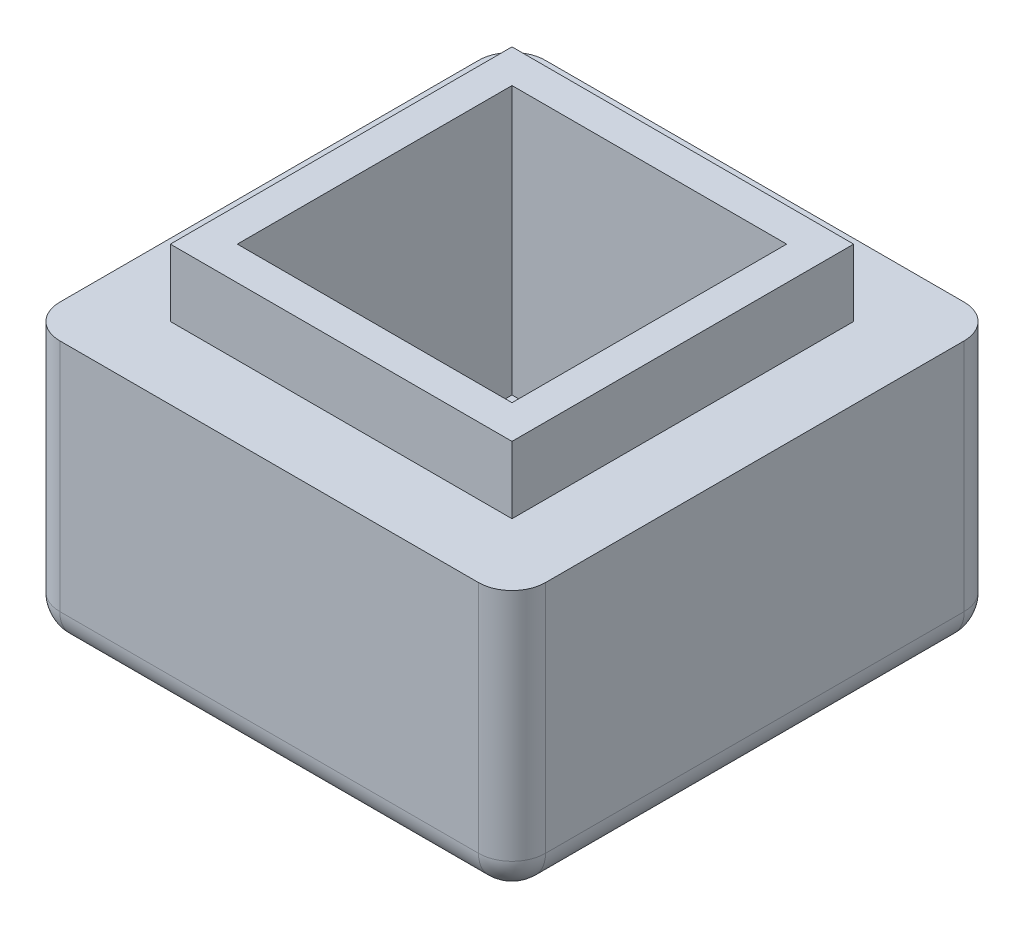
ISO-10303-21;
HEADER;
FILE_DESCRIPTION(('STEP AP214'),'2;1');
FILE_NAME('part.step','',(''),(''),'','','');
FILE_SCHEMA(('AUTOMOTIVE_DESIGN { 1 0 10303 214 1 1 1 1 }'));
ENDSEC;
DATA;
#1=APPLICATION_CONTEXT('core data for automotive mechanical design processes');
#2=APPLICATION_PROTOCOL_DEFINITION('international standard','automotive_design',2000,#1);
#3=PRODUCT_CONTEXT('',#1,'mechanical');
#4=PRODUCT('Part','Part','',(#3));
#5=PRODUCT_RELATED_PRODUCT_CATEGORY('part','',(#4));
#6=PRODUCT_DEFINITION_FORMATION('','',#4);
#7=PRODUCT_DEFINITION_CONTEXT('part definition',#1,'design');
#8=PRODUCT_DEFINITION('design','',#6,#7);
#9=PRODUCT_DEFINITION_SHAPE('','',#8);
#10=(LENGTH_UNIT() NAMED_UNIT(*) SI_UNIT(.MILLI.,.METRE.));
#11=(NAMED_UNIT(*) PLANE_ANGLE_UNIT() SI_UNIT($,.RADIAN.));
#12=(NAMED_UNIT(*) SI_UNIT($,.STERADIAN.) SOLID_ANGLE_UNIT());
#13=UNCERTAINTY_MEASURE_WITH_UNIT(LENGTH_MEASURE(1.E-05),#10,'distance_accuracy_value','');
#14=(GEOMETRIC_REPRESENTATION_CONTEXT(3) GLOBAL_UNCERTAINTY_ASSIGNED_CONTEXT((#13)) GLOBAL_UNIT_ASSIGNED_CONTEXT((#10,
#11,#12)) REPRESENTATION_CONTEXT('',''));
#15=CARTESIAN_POINT('',(0.,0.,0.));
#16=DIRECTION('',(0.,0.,1.));
#17=DIRECTION('',(1.,0.,0.));
#18=AXIS2_PLACEMENT_3D('',#15,#16,#17);
#19=CARTESIAN_POINT('',(0.,4.,0.));
#20=DIRECTION('',(0.,-1.,0.));
#21=DIRECTION('',(0.,0.,-1.));
#22=AXIS2_PLACEMENT_3D('',#19,#20,#21);
#23=PLANE('',#22);
#24=DIRECTION('',(0.,0.,1.));
#25=VECTOR('',#24,1.);
#26=CARTESIAN_POINT('',(-3.625,4.,3.625));
#27=LINE('',#26,#25);
#28=CARTESIAN_POINT('',(-3.625,4.,-3.125));
#29=VERTEX_POINT('',#28);
#30=CARTESIAN_POINT('',(-3.625,4.,3.125));
#31=VERTEX_POINT('',#30);
#32=EDGE_CURVE('E273',#29,#31,#27,.T.);
#33=ORIENTED_EDGE('',*,*,#32,.T.);
#34=CARTESIAN_POINT('',(-3.125,4.,3.125));
#35=DIRECTION('',(0.,-1.,0.));
#36=DIRECTION('',(0.,0.,-1.));
#37=AXIS2_PLACEMENT_3D('',#34,#35,#36);
#38=CIRCLE('',#37,0.5);
#39=CARTESIAN_POINT('',(-3.125,4.,3.625));
#40=VERTEX_POINT('',#39);
#41=EDGE_CURVE('E11',#31,#40,#38,.F.);
#42=ORIENTED_EDGE('',*,*,#41,.T.);
#43=DIRECTION('',(1.,0.,0.));
#44=VECTOR('',#43,1.);
#45=CARTESIAN_POINT('',(-3.625,4.,3.625));
#46=LINE('',#45,#44);
#47=CARTESIAN_POINT('',(3.125,4.,3.625));
#48=VERTEX_POINT('',#47);
#49=EDGE_CURVE('E277',#40,#48,#46,.T.);
#50=ORIENTED_EDGE('',*,*,#49,.T.);
#51=CARTESIAN_POINT('',(3.125,4.,3.125));
#52=DIRECTION('',(0.,-1.,0.));
#53=DIRECTION('',(0.,0.,-1.));
#54=AXIS2_PLACEMENT_3D('',#51,#52,#53);
#55=CIRCLE('',#54,0.5);
#56=CARTESIAN_POINT('',(3.625,4.,3.125));
#57=VERTEX_POINT('',#56);
#58=EDGE_CURVE('E332',#48,#57,#55,.F.);
#59=ORIENTED_EDGE('',*,*,#58,.T.);
#60=DIRECTION('',(0.,0.,-1.));
#61=VECTOR('',#60,1.);
#62=CARTESIAN_POINT('',(3.625,4.,3.625));
#63=LINE('',#62,#61);
#64=CARTESIAN_POINT('',(3.625,4.,-3.125));
#65=VERTEX_POINT('',#64);
#66=EDGE_CURVE('E265',#57,#65,#63,.T.);
#67=ORIENTED_EDGE('',*,*,#66,.T.);
#68=CARTESIAN_POINT('',(3.125,4.,-3.125));
#69=DIRECTION('',(0.,-1.,0.));
#70=DIRECTION('',(0.,0.,-1.));
#71=AXIS2_PLACEMENT_3D('',#68,#69,#70);
#72=CIRCLE('',#71,0.5);
#73=CARTESIAN_POINT('',(3.125,4.,-3.625));
#74=VERTEX_POINT('',#73);
#75=EDGE_CURVE('E49',#65,#74,#72,.F.);
#76=ORIENTED_EDGE('',*,*,#75,.T.);
#77=DIRECTION('',(-1.,0.,0.));
#78=VECTOR('',#77,1.);
#79=CARTESIAN_POINT('',(-3.625,4.,-3.625));
#80=LINE('',#79,#78);
#81=CARTESIAN_POINT('',(-3.125,4.,-3.625));
#82=VERTEX_POINT('',#81);
#83=EDGE_CURVE('E269',#74,#82,#80,.T.);
#84=ORIENTED_EDGE('',*,*,#83,.T.);
#85=CARTESIAN_POINT('',(-3.125,4.,-3.125));
#86=DIRECTION('',(0.,-1.,0.));
#87=DIRECTION('',(0.,0.,-1.));
#88=AXIS2_PLACEMENT_3D('',#85,#86,#87);
#89=CIRCLE('',#88,0.5);
#90=EDGE_CURVE('E329',#82,#29,#89,.F.);
#91=ORIENTED_EDGE('',*,*,#90,.T.);
#92=EDGE_LOOP('',(#33,#42,#50,#59,#67,#76,#84,#91));
#93=FACE_BOUND('',#92,.T.);
#94=DIRECTION('',(0.,0.,-1.));
#95=VECTOR('',#94,1.);
#96=CARTESIAN_POINT('',(2.55,4.,2.55));
#97=LINE('',#96,#95);
#98=CARTESIAN_POINT('',(2.55,4.,2.55));
#99=VERTEX_POINT('',#98);
#100=CARTESIAN_POINT('',(2.55,4.,-2.55));
#101=VERTEX_POINT('',#100);
#102=EDGE_CURVE('E215',#99,#101,#97,.T.);
#103=ORIENTED_EDGE('',*,*,#102,.F.);
#104=DIRECTION('',(1.,0.,0.));
#105=VECTOR('',#104,1.);
#106=CARTESIAN_POINT('',(-2.55,4.,2.55));
#107=LINE('',#106,#105);
#108=CARTESIAN_POINT('',(-2.55,4.,2.55));
#109=VERTEX_POINT('',#108);
#110=EDGE_CURVE('E226',#109,#99,#107,.T.);
#111=ORIENTED_EDGE('',*,*,#110,.F.);
#112=DIRECTION('',(0.,0.,1.));
#113=VECTOR('',#112,1.);
#114=CARTESIAN_POINT('',(-2.55,4.,2.55));
#115=LINE('',#114,#113);
#116=CARTESIAN_POINT('',(-2.55,4.,-2.55));
#117=VERTEX_POINT('',#116);
#118=EDGE_CURVE('E243',#117,#109,#115,.T.);
#119=ORIENTED_EDGE('',*,*,#118,.F.);
#120=DIRECTION('',(-1.,0.,0.));
#121=VECTOR('',#120,1.);
#122=CARTESIAN_POINT('',(-2.55,4.,-2.55));
#123=LINE('',#122,#121);
#124=EDGE_CURVE('E239',#101,#117,#123,.T.);
#125=ORIENTED_EDGE('',*,*,#124,.F.);
#126=EDGE_LOOP('',(#103,#111,#119,#125));
#127=FACE_BOUND('',#126,.T.);
#128=ADVANCED_FACE('F39',(#93,#127),#23,.F.);
#129=CARTESIAN_POINT('',(3.625,4.,3.625));
#130=DIRECTION('',(-1.,0.,0.));
#131=DIRECTION('',(0.,0.,1.));
#132=AXIS2_PLACEMENT_3D('',#129,#130,#131);
#133=PLANE('',#132);
#134=DIRECTION('',(0.,0.,-1.));
#135=VECTOR('',#134,1.);
#136=CARTESIAN_POINT('',(3.625,0.5,-3.625));
#137=LINE('',#136,#135);
#138=CARTESIAN_POINT('',(3.625,0.5,3.125));
#139=VERTEX_POINT('',#138);
#140=CARTESIAN_POINT('',(3.625,0.5,-3.125));
#141=VERTEX_POINT('',#140);
#142=EDGE_CURVE('E57',#139,#141,#137,.T.);
#143=ORIENTED_EDGE('',*,*,#142,.T.);
#144=DIRECTION('',(0.,-1.,0.));
#145=VECTOR('',#144,1.);
#146=CARTESIAN_POINT('',(3.625,4.,-3.125));
#147=LINE('',#146,#145);
#148=EDGE_CURVE('E326',#141,#65,#147,.F.);
#149=ORIENTED_EDGE('',*,*,#148,.T.);
#150=ORIENTED_EDGE('',*,*,#66,.F.);
#151=DIRECTION('',(0.,-1.,0.));
#152=VECTOR('',#151,1.);
#153=CARTESIAN_POINT('',(3.625,4.,3.125));
#154=LINE('',#153,#152);
#155=EDGE_CURVE('E62',#57,#139,#154,.T.);
#156=ORIENTED_EDGE('',*,*,#155,.T.);
#157=EDGE_LOOP('',(#143,#149,#150,#156));
#158=FACE_BOUND('',#157,.T.);
#159=ADVANCED_FACE('F399',(#158),#133,.F.);
#160=CARTESIAN_POINT('',(-3.625,4.,-3.625));
#161=DIRECTION('',(0.,0.,1.));
#162=DIRECTION('',(1.,0.,0.));
#163=AXIS2_PLACEMENT_3D('',#160,#161,#162);
#164=PLANE('',#163);
#165=ORIENTED_EDGE('',*,*,#83,.F.);
#166=DIRECTION('',(0.,-1.,0.));
#167=VECTOR('',#166,1.);
#168=CARTESIAN_POINT('',(3.125,4.,-3.625));
#169=LINE('',#168,#167);
#170=CARTESIAN_POINT('',(3.125,0.5,-3.625));
#171=VERTEX_POINT('',#170);
#172=EDGE_CURVE('E288',#74,#171,#169,.T.);
#173=ORIENTED_EDGE('',*,*,#172,.T.);
#174=DIRECTION('',(-1.,0.,0.));
#175=VECTOR('',#174,1.);
#176=CARTESIAN_POINT('',(-3.625,0.5,-3.625));
#177=LINE('',#176,#175);
#178=CARTESIAN_POINT('',(-3.125,0.5,-3.625));
#179=VERTEX_POINT('',#178);
#180=EDGE_CURVE('E284',#171,#179,#177,.T.);
#181=ORIENTED_EDGE('',*,*,#180,.T.);
#182=DIRECTION('',(0.,-1.,0.));
#183=VECTOR('',#182,1.);
#184=CARTESIAN_POINT('',(-3.125,4.,-3.625));
#185=LINE('',#184,#183);
#186=EDGE_CURVE('E281',#179,#82,#185,.F.);
#187=ORIENTED_EDGE('',*,*,#186,.T.);
#188=EDGE_LOOP('',(#165,#173,#181,#187));
#189=FACE_BOUND('',#188,.T.);
#190=ADVANCED_FACE('F440',(#189),#164,.F.);
#191=CARTESIAN_POINT('',(-3.625,4.,3.625));
#192=DIRECTION('',(1.,0.,0.));
#193=DIRECTION('',(0.,0.,-1.));
#194=AXIS2_PLACEMENT_3D('',#191,#192,#193);
#195=PLANE('',#194);
#196=DIRECTION('',(0.,0.,1.));
#197=VECTOR('',#196,1.);
#198=CARTESIAN_POINT('',(-3.625,0.5,3.625));
#199=LINE('',#198,#197);
#200=CARTESIAN_POINT('',(-3.625,0.5,-3.125));
#201=VERTEX_POINT('',#200);
#202=CARTESIAN_POINT('',(-3.625,0.5,3.125));
#203=VERTEX_POINT('',#202);
#204=EDGE_CURVE('E307',#201,#203,#199,.T.);
#205=ORIENTED_EDGE('',*,*,#204,.T.);
#206=DIRECTION('',(0.,-1.,0.));
#207=VECTOR('',#206,1.);
#208=CARTESIAN_POINT('',(-3.625,4.,3.125));
#209=LINE('',#208,#207);
#210=EDGE_CURVE('E310',#203,#31,#209,.F.);
#211=ORIENTED_EDGE('',*,*,#210,.T.);
#212=ORIENTED_EDGE('',*,*,#32,.F.);
#213=DIRECTION('',(0.,-1.,0.));
#214=VECTOR('',#213,1.);
#215=CARTESIAN_POINT('',(-3.625,4.,-3.125));
#216=LINE('',#215,#214);
#217=EDGE_CURVE('E304',#29,#201,#216,.T.);
#218=ORIENTED_EDGE('',*,*,#217,.T.);
#219=EDGE_LOOP('',(#205,#211,#212,#218));
#220=FACE_BOUND('',#219,.T.);
#221=ADVANCED_FACE('F443',(#220),#195,.F.);
#222=CARTESIAN_POINT('',(-3.625,4.,3.625));
#223=DIRECTION('',(0.,0.,-1.));
#224=DIRECTION('',(-1.,0.,0.));
#225=AXIS2_PLACEMENT_3D('',#222,#223,#224);
#226=PLANE('',#225);
#227=ORIENTED_EDGE('',*,*,#49,.F.);
#228=DIRECTION('',(0.,-1.,0.));
#229=VECTOR('',#228,1.);
#230=CARTESIAN_POINT('',(-3.125,4.,3.625));
#231=LINE('',#230,#229);
#232=CARTESIAN_POINT('',(-3.125,0.5,3.625));
#233=VERTEX_POINT('',#232);
#234=EDGE_CURVE('E319',#40,#233,#231,.T.);
#235=ORIENTED_EDGE('',*,*,#234,.T.);
#236=DIRECTION('',(1.,0.,0.));
#237=VECTOR('',#236,1.);
#238=CARTESIAN_POINT('',(3.625,0.5,3.625));
#239=LINE('',#238,#237);
#240=CARTESIAN_POINT('',(3.125,0.5,3.625));
#241=VERTEX_POINT('',#240);
#242=EDGE_CURVE('E316',#233,#241,#239,.T.);
#243=ORIENTED_EDGE('',*,*,#242,.T.);
#244=DIRECTION('',(0.,-1.,0.));
#245=VECTOR('',#244,1.);
#246=CARTESIAN_POINT('',(3.125,4.,3.625));
#247=LINE('',#246,#245);
#248=EDGE_CURVE('E313',#241,#48,#247,.F.);
#249=ORIENTED_EDGE('',*,*,#248,.T.);
#250=EDGE_LOOP('',(#227,#235,#243,#249));
#251=FACE_BOUND('',#250,.T.);
#252=ADVANCED_FACE('F408',(#251),#226,.F.);
#253=CARTESIAN_POINT('',(0.,0.,0.));
#254=DIRECTION('',(0.,-1.,0.));
#255=DIRECTION('',(0.,0.,-1.));
#256=AXIS2_PLACEMENT_3D('',#253,#254,#255);
#257=PLANE('',#256);
#258=DIRECTION('',(0.,0.,1.));
#259=VECTOR('',#258,1.);
#260=CARTESIAN_POINT('',(-3.125,0.,-3.625));
#261=LINE('',#260,#259);
#262=CARTESIAN_POINT('',(-3.125,0.,3.125));
#263=VERTEX_POINT('',#262);
#264=CARTESIAN_POINT('',(-3.125,0.,-3.125));
#265=VERTEX_POINT('',#264);
#266=EDGE_CURVE('E297',#263,#265,#261,.F.);
#267=ORIENTED_EDGE('',*,*,#266,.T.);
#268=DIRECTION('',(-1.,0.,0.));
#269=VECTOR('',#268,1.);
#270=CARTESIAN_POINT('',(3.625,0.,-3.125));
#271=LINE('',#270,#269);
#272=CARTESIAN_POINT('',(3.125,0.,-3.125));
#273=VERTEX_POINT('',#272);
#274=EDGE_CURVE('E300',#265,#273,#271,.F.);
#275=ORIENTED_EDGE('',*,*,#274,.T.);
#276=DIRECTION('',(0.,0.,-1.));
#277=VECTOR('',#276,1.);
#278=CARTESIAN_POINT('',(3.125,0.,3.625));
#279=LINE('',#278,#277);
#280=CARTESIAN_POINT('',(3.125,0.,3.125));
#281=VERTEX_POINT('',#280);
#282=EDGE_CURVE('E291',#273,#281,#279,.F.);
#283=ORIENTED_EDGE('',*,*,#282,.T.);
#284=DIRECTION('',(1.,0.,0.));
#285=VECTOR('',#284,1.);
#286=CARTESIAN_POINT('',(-3.625,0.,3.125));
#287=LINE('',#286,#285);
#288=EDGE_CURVE('E294',#281,#263,#287,.F.);
#289=ORIENTED_EDGE('',*,*,#288,.T.);
#290=EDGE_LOOP('',(#267,#275,#283,#289));
#291=FACE_BOUND('',#290,.T.);
#292=ADVANCED_FACE('F427',(#291),#257,.T.);
#293=CARTESIAN_POINT('',(2.55,5.,2.55));
#294=DIRECTION('',(-1.,0.,0.));
#295=DIRECTION('',(0.,0.,1.));
#296=AXIS2_PLACEMENT_3D('',#293,#294,#295);
#297=PLANE('',#296);
#298=ORIENTED_EDGE('',*,*,#102,.T.);
#299=DIRECTION('',(0.,-1.,0.));
#300=VECTOR('',#299,1.);
#301=CARTESIAN_POINT('',(2.55,5.,-2.55));
#302=LINE('',#301,#300);
#303=CARTESIAN_POINT('',(2.55,5.,-2.55));
#304=VERTEX_POINT('',#303);
#305=EDGE_CURVE('E261',#304,#101,#302,.T.);
#306=ORIENTED_EDGE('',*,*,#305,.F.);
#307=DIRECTION('',(0.,0.,-1.));
#308=VECTOR('',#307,1.);
#309=CARTESIAN_POINT('',(2.55,5.,2.55));
#310=LINE('',#309,#308);
#311=CARTESIAN_POINT('',(2.55,5.,2.55));
#312=VERTEX_POINT('',#311);
#313=EDGE_CURVE('E221',#312,#304,#310,.T.);
#314=ORIENTED_EDGE('',*,*,#313,.F.);
#315=DIRECTION('',(0.,-1.,0.));
#316=VECTOR('',#315,1.);
#317=CARTESIAN_POINT('',(2.55,5.,2.55));
#318=LINE('',#317,#316);
#319=EDGE_CURVE('E235',#312,#99,#318,.T.);
#320=ORIENTED_EDGE('',*,*,#319,.T.);
#321=EDGE_LOOP('',(#298,#306,#314,#320));
#322=FACE_BOUND('',#321,.T.);
#323=ADVANCED_FACE('F460',(#322),#297,.F.);
#324=CARTESIAN_POINT('',(-2.55,5.,-2.55));
#325=DIRECTION('',(0.,0.,1.));
#326=DIRECTION('',(1.,0.,0.));
#327=AXIS2_PLACEMENT_3D('',#324,#325,#326);
#328=PLANE('',#327);
#329=ORIENTED_EDGE('',*,*,#124,.T.);
#330=DIRECTION('',(0.,-1.,0.));
#331=VECTOR('',#330,1.);
#332=CARTESIAN_POINT('',(-2.55,5.,-2.55));
#333=LINE('',#332,#331);
#334=CARTESIAN_POINT('',(-2.55,5.,-2.55));
#335=VERTEX_POINT('',#334);
#336=EDGE_CURVE('E257',#335,#117,#333,.T.);
#337=ORIENTED_EDGE('',*,*,#336,.F.);
#338=DIRECTION('',(-1.,0.,0.));
#339=VECTOR('',#338,1.);
#340=CARTESIAN_POINT('',(-2.55,5.,-2.55));
#341=LINE('',#340,#339);
#342=EDGE_CURVE('E225',#304,#335,#341,.T.);
#343=ORIENTED_EDGE('',*,*,#342,.F.);
#344=ORIENTED_EDGE('',*,*,#305,.T.);
#345=EDGE_LOOP('',(#329,#337,#343,#344));
#346=FACE_BOUND('',#345,.T.);
#347=ADVANCED_FACE('F466',(#346),#328,.F.);
#348=CARTESIAN_POINT('',(-2.55,5.,2.55));
#349=DIRECTION('',(1.,0.,0.));
#350=DIRECTION('',(0.,0.,-1.));
#351=AXIS2_PLACEMENT_3D('',#348,#349,#350);
#352=PLANE('',#351);
#353=ORIENTED_EDGE('',*,*,#118,.T.);
#354=DIRECTION('',(0.,-1.,0.));
#355=VECTOR('',#354,1.);
#356=CARTESIAN_POINT('',(-2.55,5.,2.55));
#357=LINE('',#356,#355);
#358=CARTESIAN_POINT('',(-2.55,5.,2.55));
#359=VERTEX_POINT('',#358);
#360=EDGE_CURVE('E253',#359,#109,#357,.T.);
#361=ORIENTED_EDGE('',*,*,#360,.F.);
#362=DIRECTION('',(0.,0.,1.));
#363=VECTOR('',#362,1.);
#364=CARTESIAN_POINT('',(-2.55,5.,2.55));
#365=LINE('',#364,#363);
#366=EDGE_CURVE('E229',#335,#359,#365,.T.);
#367=ORIENTED_EDGE('',*,*,#366,.F.);
#368=ORIENTED_EDGE('',*,*,#336,.T.);
#369=EDGE_LOOP('',(#353,#361,#367,#368));
#370=FACE_BOUND('',#369,.T.);
#371=ADVANCED_FACE('F471',(#370),#352,.F.);
#372=CARTESIAN_POINT('',(-2.55,5.,2.55));
#373=DIRECTION('',(0.,0.,-1.));
#374=DIRECTION('',(-1.,0.,0.));
#375=AXIS2_PLACEMENT_3D('',#372,#373,#374);
#376=PLANE('',#375);
#377=ORIENTED_EDGE('',*,*,#110,.T.);
#378=ORIENTED_EDGE('',*,*,#319,.F.);
#379=DIRECTION('',(1.,0.,0.));
#380=VECTOR('',#379,1.);
#381=CARTESIAN_POINT('',(-2.55,5.,2.55));
#382=LINE('',#381,#380);
#383=EDGE_CURVE('E232',#359,#312,#382,.T.);
#384=ORIENTED_EDGE('',*,*,#383,.F.);
#385=ORIENTED_EDGE('',*,*,#360,.T.);
#386=EDGE_LOOP('',(#377,#378,#384,#385));
#387=FACE_BOUND('',#386,.T.);
#388=ADVANCED_FACE('F477',(#387),#376,.F.);
#389=CARTESIAN_POINT('',(0.,5.,0.));
#390=DIRECTION('',(0.,-1.,0.));
#391=DIRECTION('',(0.,0.,-1.));
#392=AXIS2_PLACEMENT_3D('',#389,#390,#391);
#393=PLANE('',#392);
#394=DIRECTION('',(-1.,0.,0.));
#395=VECTOR('',#394,1.);
#396=CARTESIAN_POINT('',(-2.05,5.,-2.05));
#397=LINE('',#396,#395);
#398=CARTESIAN_POINT('',(2.05,5.,-2.05));
#399=VERTEX_POINT('',#398);
#400=CARTESIAN_POINT('',(-2.05,5.,-2.05));
#401=VERTEX_POINT('',#400);
#402=EDGE_CURVE('E206',#399,#401,#397,.T.);
#403=ORIENTED_EDGE('',*,*,#402,.F.);
#404=DIRECTION('',(0.,0.,-1.));
#405=VECTOR('',#404,1.);
#406=CARTESIAN_POINT('',(2.05,5.,2.05));
#407=LINE('',#406,#405);
#408=CARTESIAN_POINT('',(2.05,5.,2.05));
#409=VERTEX_POINT('',#408);
#410=EDGE_CURVE('E173',#409,#399,#407,.T.);
#411=ORIENTED_EDGE('',*,*,#410,.F.);
#412=DIRECTION('',(1.,0.,0.));
#413=VECTOR('',#412,1.);
#414=CARTESIAN_POINT('',(-2.05,5.,2.05));
#415=LINE('',#414,#413);
#416=CARTESIAN_POINT('',(-2.05,5.,2.05));
#417=VERTEX_POINT('',#416);
#418=EDGE_CURVE('E193',#417,#409,#415,.T.);
#419=ORIENTED_EDGE('',*,*,#418,.F.);
#420=DIRECTION('',(0.,0.,1.));
#421=VECTOR('',#420,1.);
#422=CARTESIAN_POINT('',(-2.05,5.,2.05));
#423=LINE('',#422,#421);
#424=EDGE_CURVE('E197',#401,#417,#423,.T.);
#425=ORIENTED_EDGE('',*,*,#424,.F.);
#426=EDGE_LOOP('',(#403,#411,#419,#425));
#427=FACE_BOUND('',#426,.T.);
#428=ORIENTED_EDGE('',*,*,#313,.T.);
#429=ORIENTED_EDGE('',*,*,#342,.T.);
#430=ORIENTED_EDGE('',*,*,#366,.T.);
#431=ORIENTED_EDGE('',*,*,#383,.T.);
#432=EDGE_LOOP('',(#428,#429,#430,#431));
#433=FACE_BOUND('',#432,.T.);
#434=ADVANCED_FACE('F484',(#427,#433),#393,.F.);
#435=CARTESIAN_POINT('',(2.05,1.,2.05));
#436=DIRECTION('',(1.,0.,0.));
#437=DIRECTION('',(0.,0.,-1.));
#438=AXIS2_PLACEMENT_3D('',#435,#436,#437);
#439=PLANE('',#438);
#440=ORIENTED_EDGE('',*,*,#410,.T.);
#441=DIRECTION('',(0.,1.,0.));
#442=VECTOR('',#441,1.);
#443=CARTESIAN_POINT('',(2.05,1.,-2.05));
#444=LINE('',#443,#442);
#445=CARTESIAN_POINT('',(2.05,1.,-2.05));
#446=VERTEX_POINT('',#445);
#447=EDGE_CURVE('E166',#446,#399,#444,.T.);
#448=ORIENTED_EDGE('',*,*,#447,.F.);
#449=DIRECTION('',(0.,0.,-1.));
#450=VECTOR('',#449,1.);
#451=CARTESIAN_POINT('',(2.05,1.,2.05));
#452=LINE('',#451,#450);
#453=CARTESIAN_POINT('',(2.05,1.,2.05));
#454=VERTEX_POINT('',#453);
#455=EDGE_CURVE('E170',#454,#446,#452,.T.);
#456=ORIENTED_EDGE('',*,*,#455,.F.);
#457=DIRECTION('',(0.,1.,0.));
#458=VECTOR('',#457,1.);
#459=CARTESIAN_POINT('',(2.05,1.,2.05));
#460=LINE('',#459,#458);
#461=EDGE_CURVE('E212',#454,#409,#460,.T.);
#462=ORIENTED_EDGE('',*,*,#461,.T.);
#463=EDGE_LOOP('',(#440,#448,#456,#462));
#464=FACE_BOUND('',#463,.T.);
#465=ADVANCED_FACE('F168',(#464),#439,.F.);
#466=CARTESIAN_POINT('',(-2.05,1.,2.05));
#467=DIRECTION('',(0.,0.,1.));
#468=DIRECTION('',(1.,0.,0.));
#469=AXIS2_PLACEMENT_3D('',#466,#467,#468);
#470=PLANE('',#469);
#471=ORIENTED_EDGE('',*,*,#418,.T.);
#472=ORIENTED_EDGE('',*,*,#461,.F.);
#473=DIRECTION('',(1.,0.,0.));
#474=VECTOR('',#473,1.);
#475=CARTESIAN_POINT('',(-2.05,1.,2.05));
#476=LINE('',#475,#474);
#477=CARTESIAN_POINT('',(-2.05,1.,2.05));
#478=VERTEX_POINT('',#477);
#479=EDGE_CURVE('E179',#478,#454,#476,.T.);
#480=ORIENTED_EDGE('',*,*,#479,.F.);
#481=DIRECTION('',(0.,1.,0.));
#482=VECTOR('',#481,1.);
#483=CARTESIAN_POINT('',(-2.05,1.,2.05));
#484=LINE('',#483,#482);
#485=EDGE_CURVE('E216',#478,#417,#484,.T.);
#486=ORIENTED_EDGE('',*,*,#485,.T.);
#487=EDGE_LOOP('',(#471,#472,#480,#486));
#488=FACE_BOUND('',#487,.T.);
#489=ADVANCED_FACE('F492',(#488),#470,.F.);
#490=CARTESIAN_POINT('',(-2.05,1.,2.05));
#491=DIRECTION('',(-1.,0.,0.));
#492=DIRECTION('',(0.,0.,1.));
#493=AXIS2_PLACEMENT_3D('',#490,#491,#492);
#494=PLANE('',#493);
#495=ORIENTED_EDGE('',*,*,#424,.T.);
#496=ORIENTED_EDGE('',*,*,#485,.F.);
#497=DIRECTION('',(0.,0.,1.));
#498=VECTOR('',#497,1.);
#499=CARTESIAN_POINT('',(-2.05,1.,2.05));
#500=LINE('',#499,#498);
#501=CARTESIAN_POINT('',(-2.05,1.,-2.05));
#502=VERTEX_POINT('',#501);
#503=EDGE_CURVE('E188',#502,#478,#500,.T.);
#504=ORIENTED_EDGE('',*,*,#503,.F.);
#505=DIRECTION('',(0.,1.,0.));
#506=VECTOR('',#505,1.);
#507=CARTESIAN_POINT('',(-2.05,1.,-2.05));
#508=LINE('',#507,#506);
#509=EDGE_CURVE('E178',#502,#401,#508,.T.);
#510=ORIENTED_EDGE('',*,*,#509,.T.);
#511=EDGE_LOOP('',(#495,#496,#504,#510));
#512=FACE_BOUND('',#511,.T.);
#513=ADVANCED_FACE('F525',(#512),#494,.F.);
#514=CARTESIAN_POINT('',(-2.05,1.,-2.05));
#515=DIRECTION('',(0.,0.,-1.));
#516=DIRECTION('',(-1.,0.,0.));
#517=AXIS2_PLACEMENT_3D('',#514,#515,#516);
#518=PLANE('',#517);
#519=ORIENTED_EDGE('',*,*,#402,.T.);
#520=ORIENTED_EDGE('',*,*,#509,.F.);
#521=DIRECTION('',(-1.,0.,0.));
#522=VECTOR('',#521,1.);
#523=CARTESIAN_POINT('',(-2.05,1.,-2.05));
#524=LINE('',#523,#522);
#525=EDGE_CURVE('E182',#446,#502,#524,.T.);
#526=ORIENTED_EDGE('',*,*,#525,.F.);
#527=ORIENTED_EDGE('',*,*,#447,.T.);
#528=EDGE_LOOP('',(#519,#520,#526,#527));
#529=FACE_BOUND('',#528,.T.);
#530=ADVANCED_FACE('F183',(#529),#518,.F.);
#531=CARTESIAN_POINT('',(0.,1.,0.));
#532=DIRECTION('',(0.,-1.,0.));
#533=DIRECTION('',(0.,0.,-1.));
#534=AXIS2_PLACEMENT_3D('',#531,#532,#533);
#535=PLANE('',#534);
#536=ORIENTED_EDGE('',*,*,#455,.T.);
#537=ORIENTED_EDGE('',*,*,#525,.T.);
#538=ORIENTED_EDGE('',*,*,#503,.T.);
#539=ORIENTED_EDGE('',*,*,#479,.T.);
#540=EDGE_LOOP('',(#536,#537,#538,#539));
#541=FACE_BOUND('',#540,.T.);
#542=ADVANCED_FACE('F190',(#541),#535,.F.);
#543=CARTESIAN_POINT('',(3.125,4.,3.125));
#544=DIRECTION('',(0.,-1.,0.));
#545=DIRECTION('',(0.,0.,-1.));
#546=AXIS2_PLACEMENT_3D('',#543,#544,#545);
#547=CYLINDRICAL_SURFACE('',#546,0.5);
#548=ORIENTED_EDGE('',*,*,#58,.F.);
#549=ORIENTED_EDGE('',*,*,#248,.F.);
#550=CARTESIAN_POINT('',(3.125,0.5,3.125));
#551=DIRECTION('',(0.,-1.,0.));
#552=DIRECTION('',(0.,0.,-1.));
#553=AXIS2_PLACEMENT_3D('',#550,#551,#552);
#554=CIRCLE('',#553,0.5);
#555=EDGE_CURVE('E374',#139,#241,#554,.T.);
#556=ORIENTED_EDGE('',*,*,#555,.F.);
#557=ORIENTED_EDGE('',*,*,#155,.F.);
#558=EDGE_LOOP('',(#548,#549,#556,#557));
#559=FACE_BOUND('',#558,.T.);
#560=ADVANCED_FACE('F41',(#559),#547,.T.);
#561=CARTESIAN_POINT('',(-3.125,4.,3.125));
#562=DIRECTION('',(0.,-1.,0.));
#563=DIRECTION('',(0.,0.,-1.));
#564=AXIS2_PLACEMENT_3D('',#561,#562,#563);
#565=CYLINDRICAL_SURFACE('',#564,0.5);
#566=ORIENTED_EDGE('',*,*,#41,.F.);
#567=ORIENTED_EDGE('',*,*,#210,.F.);
#568=CARTESIAN_POINT('',(-3.125,0.5,3.125));
#569=DIRECTION('',(0.,-1.,0.));
#570=DIRECTION('',(0.,0.,-1.));
#571=AXIS2_PLACEMENT_3D('',#568,#569,#570);
#572=CIRCLE('',#571,0.5);
#573=EDGE_CURVE('E371',#233,#203,#572,.T.);
#574=ORIENTED_EDGE('',*,*,#573,.F.);
#575=ORIENTED_EDGE('',*,*,#234,.F.);
#576=EDGE_LOOP('',(#566,#567,#574,#575));
#577=FACE_BOUND('',#576,.T.);
#578=ADVANCED_FACE('F417',(#577),#565,.T.);
#579=CARTESIAN_POINT('',(-3.625,0.5,3.125));
#580=DIRECTION('',(-1.,0.,0.));
#581=DIRECTION('',(0.,0.,1.));
#582=AXIS2_PLACEMENT_3D('',#579,#580,#581);
#583=CYLINDRICAL_SURFACE('',#582,0.5);
#584=CARTESIAN_POINT('',(3.125,0.5,3.125));
#585=DIRECTION('',(1.,0.,0.));
#586=DIRECTION('',(0.,0.,-1.));
#587=AXIS2_PLACEMENT_3D('',#584,#585,#586);
#588=CIRCLE('',#587,0.5);
#589=EDGE_CURVE('E43',#241,#281,#588,.T.);
#590=ORIENTED_EDGE('',*,*,#589,.F.);
#591=ORIENTED_EDGE('',*,*,#242,.F.);
#592=CARTESIAN_POINT('',(-3.125,0.5,3.125));
#593=DIRECTION('',(-1.,0.,0.));
#594=DIRECTION('',(0.,0.,1.));
#595=AXIS2_PLACEMENT_3D('',#592,#593,#594);
#596=CIRCLE('',#595,0.5);
#597=EDGE_CURVE('E367',#263,#233,#596,.T.);
#598=ORIENTED_EDGE('',*,*,#597,.F.);
#599=ORIENTED_EDGE('',*,*,#288,.F.);
#600=EDGE_LOOP('',(#590,#591,#598,#599));
#601=FACE_BOUND('',#600,.T.);
#602=ADVANCED_FACE('F412',(#601),#583,.T.);
#603=CARTESIAN_POINT('',(3.125,0.5,3.125));
#604=DIRECTION('',(0.,0.,1.));
#605=DIRECTION('',(1.,0.,0.));
#606=AXIS2_PLACEMENT_3D('',#603,#604,#605);
#607=SPHERICAL_SURFACE('',#606,0.5);
#608=ORIENTED_EDGE('',*,*,#555,.T.);
#609=ORIENTED_EDGE('',*,*,#589,.T.);
#610=CARTESIAN_POINT('',(3.125,0.5,3.125));
#611=DIRECTION('',(0.,0.,1.));
#612=DIRECTION('',(1.,0.,0.));
#613=AXIS2_PLACEMENT_3D('',#610,#611,#612);
#614=CIRCLE('',#613,0.5);
#615=EDGE_CURVE('E363',#139,#281,#614,.F.);
#616=ORIENTED_EDGE('',*,*,#615,.F.);
#617=EDGE_LOOP('',(#608,#609,#616));
#618=FACE_BOUND('',#617,.T.);
#619=ADVANCED_FACE('F382',(#618),#607,.T.);
#620=CARTESIAN_POINT('',(-3.125,0.5,3.125));
#621=DIRECTION('',(0.,0.,1.));
#622=DIRECTION('',(1.,0.,0.));
#623=AXIS2_PLACEMENT_3D('',#620,#621,#622);
#624=SPHERICAL_SURFACE('',#623,0.5);
#625=ORIENTED_EDGE('',*,*,#597,.T.);
#626=ORIENTED_EDGE('',*,*,#573,.T.);
#627=CARTESIAN_POINT('',(-3.125,0.5,3.125));
#628=DIRECTION('',(0.,0.,1.));
#629=DIRECTION('',(1.,0.,0.));
#630=AXIS2_PLACEMENT_3D('',#627,#628,#629);
#631=CIRCLE('',#630,0.5);
#632=EDGE_CURVE('E359',#263,#203,#631,.F.);
#633=ORIENTED_EDGE('',*,*,#632,.F.);
#634=EDGE_LOOP('',(#625,#626,#633));
#635=FACE_BOUND('',#634,.T.);
#636=ADVANCED_FACE('F419',(#635),#624,.T.);
#637=CARTESIAN_POINT('',(3.125,0.5,3.625));
#638=DIRECTION('',(0.,0.,1.));
#639=DIRECTION('',(1.,0.,0.));
#640=AXIS2_PLACEMENT_3D('',#637,#638,#639);
#641=CYLINDRICAL_SURFACE('',#640,0.5);
#642=ORIENTED_EDGE('',*,*,#615,.T.);
#643=ORIENTED_EDGE('',*,*,#282,.F.);
#644=CARTESIAN_POINT('',(3.125,0.5,-3.125));
#645=DIRECTION('',(0.,0.,-1.));
#646=DIRECTION('',(-1.,0.,0.));
#647=AXIS2_PLACEMENT_3D('',#644,#645,#646);
#648=CIRCLE('',#647,0.5);
#649=EDGE_CURVE('E355',#141,#273,#648,.T.);
#650=ORIENTED_EDGE('',*,*,#649,.F.);
#651=ORIENTED_EDGE('',*,*,#142,.F.);
#652=EDGE_LOOP('',(#642,#643,#650,#651));
#653=FACE_BOUND('',#652,.T.);
#654=ADVANCED_FACE('F388',(#653),#641,.T.);
#655=CARTESIAN_POINT('',(3.125,4.,-3.125));
#656=DIRECTION('',(0.,-1.,0.));
#657=DIRECTION('',(0.,0.,-1.));
#658=AXIS2_PLACEMENT_3D('',#655,#656,#657);
#659=CYLINDRICAL_SURFACE('',#658,0.5);
#660=ORIENTED_EDGE('',*,*,#75,.F.);
#661=ORIENTED_EDGE('',*,*,#148,.F.);
#662=CARTESIAN_POINT('',(3.125,0.5,-3.125));
#663=DIRECTION('',(0.,-1.,0.));
#664=DIRECTION('',(0.,0.,-1.));
#665=AXIS2_PLACEMENT_3D('',#662,#663,#664);
#666=CIRCLE('',#665,0.5);
#667=EDGE_CURVE('E351',#171,#141,#666,.T.);
#668=ORIENTED_EDGE('',*,*,#667,.F.);
#669=ORIENTED_EDGE('',*,*,#172,.F.);
#670=EDGE_LOOP('',(#660,#661,#668,#669));
#671=FACE_BOUND('',#670,.T.);
#672=ADVANCED_FACE('F398',(#671),#659,.T.);
#673=CARTESIAN_POINT('',(-3.125,4.,-3.125));
#674=DIRECTION('',(0.,-1.,0.));
#675=DIRECTION('',(0.,0.,-1.));
#676=AXIS2_PLACEMENT_3D('',#673,#674,#675);
#677=CYLINDRICAL_SURFACE('',#676,0.5);
#678=ORIENTED_EDGE('',*,*,#90,.F.);
#679=ORIENTED_EDGE('',*,*,#186,.F.);
#680=CARTESIAN_POINT('',(-3.125,0.5,-3.125));
#681=DIRECTION('',(0.,-1.,0.));
#682=DIRECTION('',(0.,0.,-1.));
#683=AXIS2_PLACEMENT_3D('',#680,#681,#682);
#684=CIRCLE('',#683,0.5);
#685=EDGE_CURVE('E347',#201,#179,#684,.T.);
#686=ORIENTED_EDGE('',*,*,#685,.F.);
#687=ORIENTED_EDGE('',*,*,#217,.F.);
#688=EDGE_LOOP('',(#678,#679,#686,#687));
#689=FACE_BOUND('',#688,.T.);
#690=ADVANCED_FACE('F438',(#689),#677,.T.);
#691=CARTESIAN_POINT('',(-3.125,0.5,3.625));
#692=DIRECTION('',(0.,0.,-1.));
#693=DIRECTION('',(-1.,0.,0.));
#694=AXIS2_PLACEMENT_3D('',#691,#692,#693);
#695=CYLINDRICAL_SURFACE('',#694,0.5);
#696=ORIENTED_EDGE('',*,*,#632,.T.);
#697=ORIENTED_EDGE('',*,*,#204,.F.);
#698=CARTESIAN_POINT('',(-3.125,0.5,-3.125));
#699=DIRECTION('',(0.,0.,-1.));
#700=DIRECTION('',(-1.,0.,0.));
#701=AXIS2_PLACEMENT_3D('',#698,#699,#700);
#702=CIRCLE('',#701,0.5);
#703=EDGE_CURVE('E343',#265,#201,#702,.T.);
#704=ORIENTED_EDGE('',*,*,#703,.F.);
#705=ORIENTED_EDGE('',*,*,#266,.F.);
#706=EDGE_LOOP('',(#696,#697,#704,#705));
#707=FACE_BOUND('',#706,.T.);
#708=ADVANCED_FACE('F424',(#707),#695,.T.);
#709=CARTESIAN_POINT('',(3.125,0.5,-3.125));
#710=DIRECTION('',(1.,0.,0.));
#711=DIRECTION('',(0.,0.,-1.));
#712=AXIS2_PLACEMENT_3D('',#709,#710,#711);
#713=SPHERICAL_SURFACE('',#712,0.5);
#714=ORIENTED_EDGE('',*,*,#667,.T.);
#715=ORIENTED_EDGE('',*,*,#649,.T.);
#716=CARTESIAN_POINT('',(3.125,0.5,-3.125));
#717=DIRECTION('',(1.,0.,0.));
#718=DIRECTION('',(0.,0.,-1.));
#719=AXIS2_PLACEMENT_3D('',#716,#717,#718);
#720=CIRCLE('',#719,0.5);
#721=EDGE_CURVE('E340',#171,#273,#720,.F.);
#722=ORIENTED_EDGE('',*,*,#721,.F.);
#723=EDGE_LOOP('',(#714,#715,#722));
#724=FACE_BOUND('',#723,.T.);
#725=ADVANCED_FACE('F393',(#724),#713,.T.);
#726=CARTESIAN_POINT('',(-3.125,0.5,-3.125));
#727=DIRECTION('',(-1.,0.,0.));
#728=DIRECTION('',(0.,0.,1.));
#729=AXIS2_PLACEMENT_3D('',#726,#727,#728);
#730=SPHERICAL_SURFACE('',#729,0.5);
#731=ORIENTED_EDGE('',*,*,#703,.T.);
#732=ORIENTED_EDGE('',*,*,#685,.T.);
#733=CARTESIAN_POINT('',(-3.125,0.5,-3.125));
#734=DIRECTION('',(-1.,0.,0.));
#735=DIRECTION('',(0.,0.,1.));
#736=AXIS2_PLACEMENT_3D('',#733,#734,#735);
#737=CIRCLE('',#736,0.5);
#738=EDGE_CURVE('E337',#265,#179,#737,.F.);
#739=ORIENTED_EDGE('',*,*,#738,.F.);
#740=EDGE_LOOP('',(#731,#732,#739));
#741=FACE_BOUND('',#740,.T.);
#742=ADVANCED_FACE('F432',(#741),#730,.T.);
#743=CARTESIAN_POINT('',(-3.625,0.5,-3.125));
#744=DIRECTION('',(1.,0.,0.));
#745=DIRECTION('',(0.,0.,-1.));
#746=AXIS2_PLACEMENT_3D('',#743,#744,#745);
#747=CYLINDRICAL_SURFACE('',#746,0.5);
#748=ORIENTED_EDGE('',*,*,#721,.T.);
#749=ORIENTED_EDGE('',*,*,#274,.F.);
#750=ORIENTED_EDGE('',*,*,#738,.T.);
#751=ORIENTED_EDGE('',*,*,#180,.F.);
#752=EDGE_LOOP('',(#748,#749,#750,#751));
#753=FACE_BOUND('',#752,.T.);
#754=ADVANCED_FACE('F430',(#753),#747,.T.);
#755=CLOSED_SHELL('',(#128,#159,#190,#221,#252,#292,#323,#347,#371,#388,#434,#465,#489,#513,
#530,#542,#560,#578,#602,#619,#636,#654,#672,#690,#708,#725,#742,#754));
#756=MANIFOLD_SOLID_BREP('B2',#755);
#757=ADVANCED_BREP_SHAPE_REPRESENTATION('',(#18,#756),#14);
#758=SHAPE_DEFINITION_REPRESENTATION(#9,#757);
ENDSEC;
END-ISO-10303-21;
